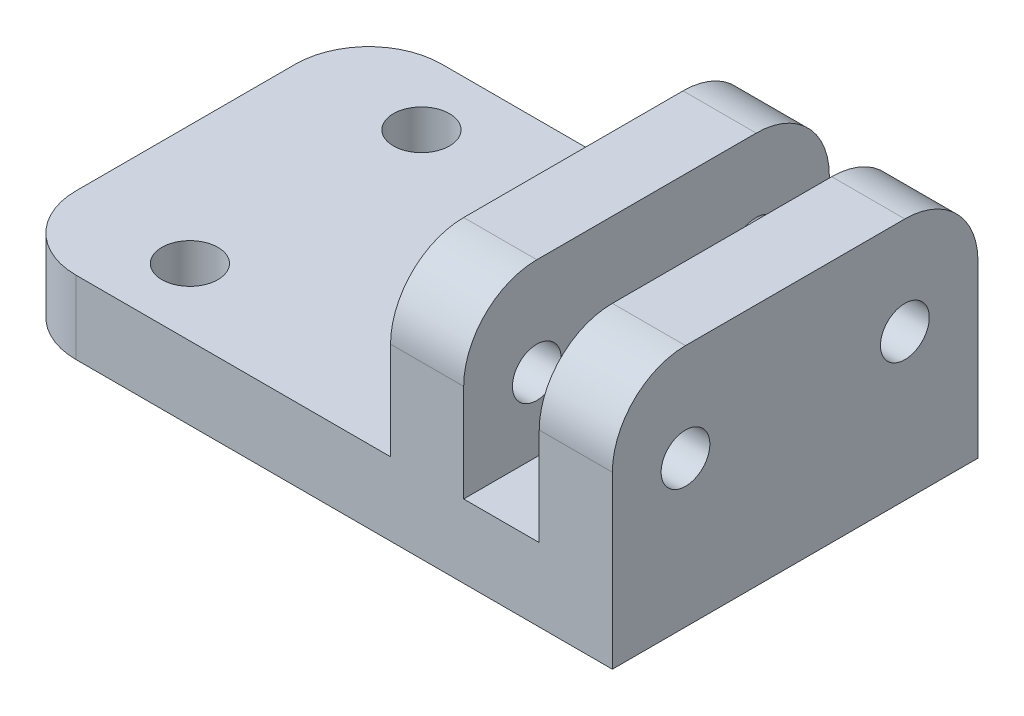
ISO-10303-21;
HEADER;
FILE_DESCRIPTION(('STEP AP214'),'2;1');
FILE_NAME('part.step','',(''),(''),'','','');
FILE_SCHEMA(('AUTOMOTIVE_DESIGN { 1 0 10303 214 1 1 1 1 }'));
ENDSEC;
DATA;
#1=APPLICATION_CONTEXT('core data for automotive mechanical design processes');
#2=APPLICATION_PROTOCOL_DEFINITION('international standard','automotive_design',2000,#1);
#3=PRODUCT_CONTEXT('',#1,'mechanical');
#4=PRODUCT('Part','Part','',(#3));
#5=PRODUCT_RELATED_PRODUCT_CATEGORY('part','',(#4));
#6=PRODUCT_DEFINITION_FORMATION('','',#4);
#7=PRODUCT_DEFINITION_CONTEXT('part definition',#1,'design');
#8=PRODUCT_DEFINITION('design','',#6,#7);
#9=PRODUCT_DEFINITION_SHAPE('','',#8);
#10=(LENGTH_UNIT() NAMED_UNIT(*) SI_UNIT(.MILLI.,.METRE.));
#11=(NAMED_UNIT(*) PLANE_ANGLE_UNIT() SI_UNIT($,.RADIAN.));
#12=(NAMED_UNIT(*) SI_UNIT($,.STERADIAN.) SOLID_ANGLE_UNIT());
#13=UNCERTAINTY_MEASURE_WITH_UNIT(LENGTH_MEASURE(1.E-05),#10,'distance_accuracy_value','');
#14=(GEOMETRIC_REPRESENTATION_CONTEXT(3) GLOBAL_UNCERTAINTY_ASSIGNED_CONTEXT((#13)) GLOBAL_UNIT_ASSIGNED_CONTEXT((#10,
#11,#12)) REPRESENTATION_CONTEXT('',''));
#15=CARTESIAN_POINT('',(0.,0.,0.));
#16=DIRECTION('',(0.,0.,1.));
#17=DIRECTION('',(1.,0.,0.));
#18=AXIS2_PLACEMENT_3D('',#15,#16,#17);
#19=CARTESIAN_POINT('',(0.,3.,0.));
#20=DIRECTION('',(0.,1.,0.));
#21=DIRECTION('',(0.,0.,1.));
#22=AXIS2_PLACEMENT_3D('',#19,#20,#21);
#23=PLANE('',#22);
#24=DIRECTION('',(1.,0.,0.));
#25=VECTOR('',#24,1.);
#26=CARTESIAN_POINT('',(0.,3.,0.));
#27=LINE('',#26,#25);
#28=CARTESIAN_POINT('',(18.9,3.,0.));
#29=VERTEX_POINT('',#28);
#30=CARTESIAN_POINT('',(22.,3.,0.));
#31=VERTEX_POINT('',#30);
#32=EDGE_CURVE('E272',#29,#31,#27,.T.);
#33=ORIENTED_EDGE('',*,*,#32,.T.);
#34=DIRECTION('',(0.,0.,-1.));
#35=VECTOR('',#34,1.);
#36=CARTESIAN_POINT('',(22.,3.,0.));
#37=LINE('',#36,#35);
#38=CARTESIAN_POINT('',(22.,3.,-15.));
#39=VERTEX_POINT('',#38);
#40=EDGE_CURVE('E485',#31,#39,#37,.T.);
#41=ORIENTED_EDGE('',*,*,#40,.T.);
#42=DIRECTION('',(1.,0.,0.));
#43=VECTOR('',#42,1.);
#44=CARTESIAN_POINT('',(0.,3.,-15.));
#45=LINE('',#44,#43);
#46=CARTESIAN_POINT('',(18.9,3.,-15.));
#47=VERTEX_POINT('',#46);
#48=EDGE_CURVE('E276',#47,#39,#45,.T.);
#49=ORIENTED_EDGE('',*,*,#48,.F.);
#50=DIRECTION('',(0.,0.,-1.));
#51=VECTOR('',#50,1.);
#52=CARTESIAN_POINT('',(18.9,3.,0.));
#53=LINE('',#52,#51);
#54=EDGE_CURVE('E257',#29,#47,#53,.T.);
#55=ORIENTED_EDGE('',*,*,#54,.F.);
#56=EDGE_LOOP('',(#33,#41,#49,#55));
#57=FACE_BOUND('',#56,.T.);
#58=ADVANCED_FACE('F35',(#57),#23,.T.);
#59=CARTESIAN_POINT('',(4.91746575843865,3.,-2.75));
#60=DIRECTION('',(0.,1.,0.));
#61=DIRECTION('',(0.,0.,1.));
#62=AXIS2_PLACEMENT_3D('',#59,#60,#61);
#63=CIRCLE('',#62,1.15);
#64=CARTESIAN_POINT('',(4.91746575843865,3.,-1.6));
#65=VERTEX_POINT('',#64);
#66=EDGE_CURVE('E188',#65,#65,#63,.T.);
#67=ORIENTED_EDGE('',*,*,#66,.F.);
#68=EDGE_LOOP('',(#67));
#69=FACE_BOUND('',#68,.T.);
#70=CARTESIAN_POINT('',(4.91746575843865,3.,-12.25));
#71=DIRECTION('',(0.,1.,0.));
#72=DIRECTION('',(0.,0.,1.));
#73=AXIS2_PLACEMENT_3D('',#70,#71,#72);
#74=CIRCLE('',#73,1.15);
#75=CARTESIAN_POINT('',(4.91746575843865,3.,-11.1));
#76=VERTEX_POINT('',#75);
#77=EDGE_CURVE('E269',#76,#76,#74,.T.);
#78=ORIENTED_EDGE('',*,*,#77,.F.);
#79=EDGE_LOOP('',(#78));
#80=FACE_BOUND('',#79,.T.);
#81=CARTESIAN_POINT('',(3.,3.,0.));
#82=VERTEX_POINT('',#81);
#83=CARTESIAN_POINT('',(15.9,3.,0.));
#84=VERTEX_POINT('',#83);
#85=EDGE_CURVE('E273',#82,#84,#27,.T.);
#86=ORIENTED_EDGE('',*,*,#85,.T.);
#87=DIRECTION('',(0.,0.,-1.));
#88=VECTOR('',#87,1.);
#89=CARTESIAN_POINT('',(15.9,3.,0.));
#90=LINE('',#89,#88);
#91=CARTESIAN_POINT('',(15.9,3.,-15.));
#92=VERTEX_POINT('',#91);
#93=EDGE_CURVE('E258',#84,#92,#90,.T.);
#94=ORIENTED_EDGE('',*,*,#93,.T.);
#95=CARTESIAN_POINT('',(3.,3.,-15.));
#96=VERTEX_POINT('',#95);
#97=EDGE_CURVE('E277',#96,#92,#45,.T.);
#98=ORIENTED_EDGE('',*,*,#97,.F.);
#99=CARTESIAN_POINT('',(3.,3.,-12.));
#100=DIRECTION('',(0.,1.,0.));
#101=DIRECTION('',(0.,0.,1.));
#102=AXIS2_PLACEMENT_3D('',#99,#100,#101);
#103=CIRCLE('',#102,3.);
#104=CARTESIAN_POINT('',(0.,3.,-12.));
#105=VERTEX_POINT('',#104);
#106=EDGE_CURVE('E203',#96,#105,#103,.T.);
#107=ORIENTED_EDGE('',*,*,#106,.T.);
#108=DIRECTION('',(0.,0.,-1.));
#109=VECTOR('',#108,1.);
#110=CARTESIAN_POINT('',(0.,3.,0.));
#111=LINE('',#110,#109);
#112=CARTESIAN_POINT('',(0.,3.,-3.));
#113=VERTEX_POINT('',#112);
#114=EDGE_CURVE('E192',#113,#105,#111,.T.);
#115=ORIENTED_EDGE('',*,*,#114,.F.);
#116=CARTESIAN_POINT('',(3.,3.,-3.));
#117=DIRECTION('',(0.,1.,0.));
#118=DIRECTION('',(0.,0.,1.));
#119=AXIS2_PLACEMENT_3D('',#116,#117,#118);
#120=CIRCLE('',#119,3.);
#121=EDGE_CURVE('E201',#113,#82,#120,.T.);
#122=ORIENTED_EDGE('',*,*,#121,.T.);
#123=EDGE_LOOP('',(#86,#94,#98,#107,#115,#122));
#124=FACE_BOUND('',#123,.T.);
#125=ADVANCED_FACE('F300',(#69,#80,#124),#23,.T.);
#126=CARTESIAN_POINT('',(0.,3.,0.));
#127=DIRECTION('',(0.,0.,-1.));
#128=DIRECTION('',(-1.,0.,0.));
#129=AXIS2_PLACEMENT_3D('',#126,#127,#128);
#130=PLANE('',#129);
#131=DIRECTION('',(0.,-1.,0.));
#132=VECTOR('',#131,1.);
#133=CARTESIAN_POINT('',(25.,10.,0.));
#134=LINE('',#133,#132);
#135=CARTESIAN_POINT('',(25.,7.,0.));
#136=VERTEX_POINT('',#135);
#137=CARTESIAN_POINT('',(25.,0.,0.));
#138=VERTEX_POINT('',#137);
#139=EDGE_CURVE('E150',#136,#138,#134,.T.);
#140=ORIENTED_EDGE('',*,*,#139,.F.);
#141=DIRECTION('',(1.,0.,0.));
#142=VECTOR('',#141,1.);
#143=CARTESIAN_POINT('',(22.,7.,0.));
#144=LINE('',#143,#142);
#145=CARTESIAN_POINT('',(22.,7.,0.));
#146=VERTEX_POINT('',#145);
#147=EDGE_CURVE('E226',#136,#146,#144,.F.);
#148=ORIENTED_EDGE('',*,*,#147,.T.);
#149=DIRECTION('',(0.,-1.,0.));
#150=VECTOR('',#149,1.);
#151=CARTESIAN_POINT('',(22.,10.,0.));
#152=LINE('',#151,#150);
#153=EDGE_CURVE('E160',#146,#31,#152,.T.);
#154=ORIENTED_EDGE('',*,*,#153,.T.);
#155=ORIENTED_EDGE('',*,*,#32,.F.);
#156=DIRECTION('',(0.,-1.,0.));
#157=VECTOR('',#156,1.);
#158=CARTESIAN_POINT('',(18.9,10.,0.));
#159=LINE('',#158,#157);
#160=CARTESIAN_POINT('',(18.9,7.,0.));
#161=VERTEX_POINT('',#160);
#162=EDGE_CURVE('E482',#161,#29,#159,.T.);
#163=ORIENTED_EDGE('',*,*,#162,.F.);
#164=DIRECTION('',(1.,0.,0.));
#165=VECTOR('',#164,1.);
#166=CARTESIAN_POINT('',(15.9,7.,0.));
#167=LINE('',#166,#165);
#168=CARTESIAN_POINT('',(15.9,7.,0.));
#169=VERTEX_POINT('',#168);
#170=EDGE_CURVE('E224',#161,#169,#167,.F.);
#171=ORIENTED_EDGE('',*,*,#170,.T.);
#172=DIRECTION('',(0.,-1.,0.));
#173=VECTOR('',#172,1.);
#174=CARTESIAN_POINT('',(15.9,10.,0.));
#175=LINE('',#174,#173);
#176=EDGE_CURVE('E262',#169,#84,#175,.T.);
#177=ORIENTED_EDGE('',*,*,#176,.T.);
#178=ORIENTED_EDGE('',*,*,#85,.F.);
#179=DIRECTION('',(0.,-1.,0.));
#180=VECTOR('',#179,1.);
#181=CARTESIAN_POINT('',(3.,0.,0.));
#182=LINE('',#181,#180);
#183=CARTESIAN_POINT('',(3.,0.,0.));
#184=VERTEX_POINT('',#183);
#185=EDGE_CURVE('E176',#82,#184,#182,.T.);
#186=ORIENTED_EDGE('',*,*,#185,.T.);
#187=DIRECTION('',(1.,0.,0.));
#188=VECTOR('',#187,1.);
#189=CARTESIAN_POINT('',(0.,0.,0.));
#190=LINE('',#189,#188);
#191=EDGE_CURVE('E168',#184,#138,#190,.T.);
#192=ORIENTED_EDGE('',*,*,#191,.T.);
#193=EDGE_LOOP('',(#140,#148,#154,#155,#163,#171,#177,#178,#186,#192));
#194=FACE_BOUND('',#193,.T.);
#195=ADVANCED_FACE('F173',(#194),#130,.F.);
#196=CARTESIAN_POINT('',(25.,3.,0.));
#197=DIRECTION('',(-1.,0.,0.));
#198=DIRECTION('',(0.,0.,1.));
#199=AXIS2_PLACEMENT_3D('',#196,#197,#198);
#200=PLANE('',#199);
#201=CARTESIAN_POINT('',(25.,6.,-12.));
#202=DIRECTION('',(-1.,0.,0.));
#203=DIRECTION('',(0.,0.,1.));
#204=AXIS2_PLACEMENT_3D('',#201,#202,#203);
#205=CIRCLE('',#204,1.);
#206=CARTESIAN_POINT('',(25.,6.,-11.));
#207=VERTEX_POINT('',#206);
#208=EDGE_CURVE('E211',#207,#207,#205,.T.);
#209=ORIENTED_EDGE('',*,*,#208,.T.);
#210=EDGE_LOOP('',(#209));
#211=FACE_BOUND('',#210,.T.);
#212=CARTESIAN_POINT('',(25.,6.,-3.));
#213=DIRECTION('',(-1.,0.,0.));
#214=DIRECTION('',(0.,0.,1.));
#215=AXIS2_PLACEMENT_3D('',#212,#213,#214);
#216=CIRCLE('',#215,1.);
#217=CARTESIAN_POINT('',(25.,6.,-2.));
#218=VERTEX_POINT('',#217);
#219=EDGE_CURVE('E533',#218,#218,#216,.T.);
#220=ORIENTED_EDGE('',*,*,#219,.T.);
#221=EDGE_LOOP('',(#220));
#222=FACE_BOUND('',#221,.T.);
#223=DIRECTION('',(0.,0.,-1.));
#224=VECTOR('',#223,1.);
#225=CARTESIAN_POINT('',(25.,10.,0.));
#226=LINE('',#225,#224);
#227=CARTESIAN_POINT('',(25.,10.,-3.));
#228=VERTEX_POINT('',#227);
#229=CARTESIAN_POINT('',(25.,10.,-12.));
#230=VERTEX_POINT('',#229);
#231=EDGE_CURVE('E501',#228,#230,#226,.T.);
#232=ORIENTED_EDGE('',*,*,#231,.F.);
#233=CARTESIAN_POINT('',(25.,7.,-3.));
#234=DIRECTION('',(-1.,0.,0.));
#235=DIRECTION('',(0.,0.,1.));
#236=AXIS2_PLACEMENT_3D('',#233,#234,#235);
#237=CIRCLE('',#236,3.);
#238=EDGE_CURVE('E156',#228,#136,#237,.F.);
#239=ORIENTED_EDGE('',*,*,#238,.T.);
#240=ORIENTED_EDGE('',*,*,#139,.T.);
#241=DIRECTION('',(0.,0.,-1.));
#242=VECTOR('',#241,1.);
#243=CARTESIAN_POINT('',(25.,0.,0.));
#244=LINE('',#243,#242);
#245=CARTESIAN_POINT('',(25.,0.,-15.));
#246=VERTEX_POINT('',#245);
#247=EDGE_CURVE('E155',#138,#246,#244,.T.);
#248=ORIENTED_EDGE('',*,*,#247,.T.);
#249=DIRECTION('',(0.,-1.,0.));
#250=VECTOR('',#249,1.);
#251=CARTESIAN_POINT('',(25.,10.,-15.));
#252=LINE('',#251,#250);
#253=CARTESIAN_POINT('',(25.,7.,-15.));
#254=VERTEX_POINT('',#253);
#255=EDGE_CURVE('E161',#254,#246,#252,.T.);
#256=ORIENTED_EDGE('',*,*,#255,.F.);
#257=CARTESIAN_POINT('',(25.,7.,-12.));
#258=DIRECTION('',(-1.,0.,0.));
#259=DIRECTION('',(0.,0.,1.));
#260=AXIS2_PLACEMENT_3D('',#257,#258,#259);
#261=CIRCLE('',#260,3.);
#262=EDGE_CURVE('E221',#254,#230,#261,.F.);
#263=ORIENTED_EDGE('',*,*,#262,.T.);
#264=EDGE_LOOP('',(#232,#239,#240,#248,#256,#263));
#265=FACE_BOUND('',#264,.T.);
#266=ADVANCED_FACE('F153',(#211,#222,#265),#200,.F.);
#267=CARTESIAN_POINT('',(0.,3.,-15.));
#268=DIRECTION('',(0.,0.,-1.));
#269=DIRECTION('',(-1.,0.,0.));
#270=AXIS2_PLACEMENT_3D('',#267,#268,#269);
#271=PLANE('',#270);
#272=DIRECTION('',(0.,-1.,0.));
#273=VECTOR('',#272,1.);
#274=CARTESIAN_POINT('',(22.,10.,-15.));
#275=LINE('',#274,#273);
#276=CARTESIAN_POINT('',(22.,7.,-15.));
#277=VERTEX_POINT('',#276);
#278=EDGE_CURVE('E509',#277,#39,#275,.T.);
#279=ORIENTED_EDGE('',*,*,#278,.F.);
#280=DIRECTION('',(1.,0.,0.));
#281=VECTOR('',#280,1.);
#282=CARTESIAN_POINT('',(0.,7.,-15.));
#283=LINE('',#282,#281);
#284=EDGE_CURVE('E11',#277,#254,#283,.T.);
#285=ORIENTED_EDGE('',*,*,#284,.T.);
#286=ORIENTED_EDGE('',*,*,#255,.T.);
#287=DIRECTION('',(1.,0.,0.));
#288=VECTOR('',#287,1.);
#289=CARTESIAN_POINT('',(0.,0.,-15.));
#290=LINE('',#289,#288);
#291=CARTESIAN_POINT('',(3.,0.,-15.));
#292=VERTEX_POINT('',#291);
#293=EDGE_CURVE('E170',#292,#246,#290,.T.);
#294=ORIENTED_EDGE('',*,*,#293,.F.);
#295=DIRECTION('',(0.,-1.,0.));
#296=VECTOR('',#295,1.);
#297=CARTESIAN_POINT('',(3.,3.,-15.));
#298=LINE('',#297,#296);
#299=EDGE_CURVE('E199',#292,#96,#298,.F.);
#300=ORIENTED_EDGE('',*,*,#299,.T.);
#301=ORIENTED_EDGE('',*,*,#97,.T.);
#302=DIRECTION('',(0.,-1.,0.));
#303=VECTOR('',#302,1.);
#304=CARTESIAN_POINT('',(15.9,10.,-15.));
#305=LINE('',#304,#303);
#306=CARTESIAN_POINT('',(15.9,7.,-15.));
#307=VERTEX_POINT('',#306);
#308=EDGE_CURVE('E250',#307,#92,#305,.T.);
#309=ORIENTED_EDGE('',*,*,#308,.F.);
#310=DIRECTION('',(1.,0.,0.));
#311=VECTOR('',#310,1.);
#312=CARTESIAN_POINT('',(0.,7.,-15.));
#313=LINE('',#312,#311);
#314=CARTESIAN_POINT('',(18.9,7.,-15.));
#315=VERTEX_POINT('',#314);
#316=EDGE_CURVE('E43',#307,#315,#313,.T.);
#317=ORIENTED_EDGE('',*,*,#316,.T.);
#318=DIRECTION('',(0.,-1.,0.));
#319=VECTOR('',#318,1.);
#320=CARTESIAN_POINT('',(18.9,10.,-15.));
#321=LINE('',#320,#319);
#322=EDGE_CURVE('E247',#315,#47,#321,.T.);
#323=ORIENTED_EDGE('',*,*,#322,.T.);
#324=ORIENTED_EDGE('',*,*,#48,.T.);
#325=EDGE_LOOP('',(#279,#285,#286,#294,#300,#301,#309,#317,#323,#324));
#326=FACE_BOUND('',#325,.T.);
#327=ADVANCED_FACE('F245',(#326),#271,.T.);
#328=CARTESIAN_POINT('',(4.91746575843865,3.,-12.25));
#329=DIRECTION('',(0.,-1.,0.));
#330=DIRECTION('',(0.,0.,-1.));
#331=AXIS2_PLACEMENT_3D('',#328,#329,#330);
#332=CYLINDRICAL_SURFACE('',#331,1.15);
#333=ORIENTED_EDGE('',*,*,#77,.T.);
#334=EDGE_LOOP('',(#333));
#335=FACE_BOUND('',#334,.T.);
#336=CARTESIAN_POINT('',(4.91746575843865,0.,-12.25));
#337=DIRECTION('',(0.,1.,0.));
#338=DIRECTION('',(0.,0.,1.));
#339=AXIS2_PLACEMENT_3D('',#336,#337,#338);
#340=CIRCLE('',#339,1.15);
#341=CARTESIAN_POINT('',(4.91746575843865,0.,-11.1));
#342=VERTEX_POINT('',#341);
#343=EDGE_CURVE('E177',#342,#342,#340,.T.);
#344=ORIENTED_EDGE('',*,*,#343,.F.);
#345=EDGE_LOOP('',(#344));
#346=FACE_BOUND('',#345,.T.);
#347=ADVANCED_FACE('F287',(#335,#346),#332,.F.);
#348=CARTESIAN_POINT('',(4.91746575843865,3.,-2.75));
#349=DIRECTION('',(0.,-1.,0.));
#350=DIRECTION('',(0.,0.,-1.));
#351=AXIS2_PLACEMENT_3D('',#348,#349,#350);
#352=CYLINDRICAL_SURFACE('',#351,1.15);
#353=ORIENTED_EDGE('',*,*,#66,.T.);
#354=EDGE_LOOP('',(#353));
#355=FACE_BOUND('',#354,.T.);
#356=CARTESIAN_POINT('',(4.91746575843865,0.,-2.75));
#357=DIRECTION('',(0.,1.,0.));
#358=DIRECTION('',(0.,0.,1.));
#359=AXIS2_PLACEMENT_3D('',#356,#357,#358);
#360=CIRCLE('',#359,1.15);
#361=CARTESIAN_POINT('',(4.91746575843865,0.,-1.6));
#362=VERTEX_POINT('',#361);
#363=EDGE_CURVE('E180',#362,#362,#360,.T.);
#364=ORIENTED_EDGE('',*,*,#363,.F.);
#365=EDGE_LOOP('',(#364));
#366=FACE_BOUND('',#365,.T.);
#367=ADVANCED_FACE('F284',(#355,#366),#352,.F.);
#368=CARTESIAN_POINT('',(0.,3.,0.));
#369=DIRECTION('',(-1.,0.,0.));
#370=DIRECTION('',(0.,0.,1.));
#371=AXIS2_PLACEMENT_3D('',#368,#369,#370);
#372=PLANE('',#371);
#373=ORIENTED_EDGE('',*,*,#114,.T.);
#374=DIRECTION('',(0.,-1.,0.));
#375=VECTOR('',#374,1.);
#376=CARTESIAN_POINT('',(0.,3.,-12.));
#377=LINE('',#376,#375);
#378=CARTESIAN_POINT('',(0.,0.,-12.));
#379=VERTEX_POINT('',#378);
#380=EDGE_CURVE('E191',#105,#379,#377,.T.);
#381=ORIENTED_EDGE('',*,*,#380,.T.);
#382=DIRECTION('',(0.,0.,-1.));
#383=VECTOR('',#382,1.);
#384=CARTESIAN_POINT('',(0.,0.,0.));
#385=LINE('',#384,#383);
#386=CARTESIAN_POINT('',(0.,0.,-3.));
#387=VERTEX_POINT('',#386);
#388=EDGE_CURVE('E185',#387,#379,#385,.T.);
#389=ORIENTED_EDGE('',*,*,#388,.F.);
#390=DIRECTION('',(0.,-1.,0.));
#391=VECTOR('',#390,1.);
#392=CARTESIAN_POINT('',(0.,3.,-3.));
#393=LINE('',#392,#391);
#394=EDGE_CURVE('E189',#387,#113,#393,.F.);
#395=ORIENTED_EDGE('',*,*,#394,.T.);
#396=EDGE_LOOP('',(#373,#381,#389,#395));
#397=FACE_BOUND('',#396,.T.);
#398=ADVANCED_FACE('F286',(#397),#372,.T.);
#399=CARTESIAN_POINT('',(0.,0.,0.));
#400=DIRECTION('',(0.,1.,0.));
#401=DIRECTION('',(0.,0.,1.));
#402=AXIS2_PLACEMENT_3D('',#399,#400,#401);
#403=PLANE('',#402);
#404=ORIENTED_EDGE('',*,*,#247,.F.);
#405=ORIENTED_EDGE('',*,*,#191,.F.);
#406=CARTESIAN_POINT('',(3.,0.,-3.));
#407=DIRECTION('',(0.,1.,0.));
#408=DIRECTION('',(0.,0.,1.));
#409=AXIS2_PLACEMENT_3D('',#406,#407,#408);
#410=CIRCLE('',#409,3.);
#411=EDGE_CURVE('E195',#184,#387,#410,.F.);
#412=ORIENTED_EDGE('',*,*,#411,.T.);
#413=ORIENTED_EDGE('',*,*,#388,.T.);
#414=CARTESIAN_POINT('',(3.,0.,-12.));
#415=DIRECTION('',(0.,1.,0.));
#416=DIRECTION('',(0.,0.,1.));
#417=AXIS2_PLACEMENT_3D('',#414,#415,#416);
#418=CIRCLE('',#417,3.);
#419=EDGE_CURVE('E197',#379,#292,#418,.F.);
#420=ORIENTED_EDGE('',*,*,#419,.T.);
#421=ORIENTED_EDGE('',*,*,#293,.T.);
#422=EDGE_LOOP('',(#404,#405,#412,#413,#420,#421));
#423=FACE_BOUND('',#422,.T.);
#424=ORIENTED_EDGE('',*,*,#363,.T.);
#425=EDGE_LOOP('',(#424));
#426=FACE_BOUND('',#425,.T.);
#427=ORIENTED_EDGE('',*,*,#343,.T.);
#428=EDGE_LOOP('',(#427));
#429=FACE_BOUND('',#428,.T.);
#430=ADVANCED_FACE('F166',(#423,#426,#429),#403,.F.);
#431=CARTESIAN_POINT('',(3.,3.,-12.));
#432=DIRECTION('',(0.,-1.,0.));
#433=DIRECTION('',(0.,0.,-1.));
#434=AXIS2_PLACEMENT_3D('',#431,#432,#433);
#435=CYLINDRICAL_SURFACE('',#434,3.);
#436=ORIENTED_EDGE('',*,*,#106,.F.);
#437=ORIENTED_EDGE('',*,*,#299,.F.);
#438=ORIENTED_EDGE('',*,*,#419,.F.);
#439=ORIENTED_EDGE('',*,*,#380,.F.);
#440=EDGE_LOOP('',(#436,#437,#438,#439));
#441=FACE_BOUND('',#440,.T.);
#442=ADVANCED_FACE('F312',(#441),#435,.T.);
#443=CARTESIAN_POINT('',(3.,3.,-3.));
#444=DIRECTION('',(0.,1.,0.));
#445=DIRECTION('',(0.,0.,1.));
#446=AXIS2_PLACEMENT_3D('',#443,#444,#445);
#447=CYLINDRICAL_SURFACE('',#446,3.);
#448=ORIENTED_EDGE('',*,*,#121,.F.);
#449=ORIENTED_EDGE('',*,*,#394,.F.);
#450=ORIENTED_EDGE('',*,*,#411,.F.);
#451=ORIENTED_EDGE('',*,*,#185,.F.);
#452=EDGE_LOOP('',(#448,#449,#450,#451));
#453=FACE_BOUND('',#452,.T.);
#454=ADVANCED_FACE('F359',(#453),#447,.T.);
#455=CARTESIAN_POINT('',(18.9,10.,0.));
#456=DIRECTION('',(1.,0.,0.));
#457=DIRECTION('',(0.,0.,-1.));
#458=AXIS2_PLACEMENT_3D('',#455,#456,#457);
#459=PLANE('',#458);
#460=CARTESIAN_POINT('',(18.9,6.,-12.));
#461=DIRECTION('',(1.,0.,0.));
#462=DIRECTION('',(0.,0.,-1.));
#463=AXIS2_PLACEMENT_3D('',#460,#461,#462);
#464=CIRCLE('',#463,1.);
#465=CARTESIAN_POINT('',(18.9,6.,-13.));
#466=VERTEX_POINT('',#465);
#467=EDGE_CURVE('E523',#466,#466,#464,.T.);
#468=ORIENTED_EDGE('',*,*,#467,.F.);
#469=EDGE_LOOP('',(#468));
#470=FACE_BOUND('',#469,.T.);
#471=CARTESIAN_POINT('',(18.9,6.,-3.));
#472=DIRECTION('',(1.,0.,0.));
#473=DIRECTION('',(0.,0.,-1.));
#474=AXIS2_PLACEMENT_3D('',#471,#472,#473);
#475=CIRCLE('',#474,1.);
#476=CARTESIAN_POINT('',(18.9,6.,-4.));
#477=VERTEX_POINT('',#476);
#478=EDGE_CURVE('E216',#477,#477,#475,.T.);
#479=ORIENTED_EDGE('',*,*,#478,.F.);
#480=EDGE_LOOP('',(#479));
#481=FACE_BOUND('',#480,.T.);
#482=DIRECTION('',(0.,0.,1.));
#483=VECTOR('',#482,1.);
#484=CARTESIAN_POINT('',(18.9,10.,0.));
#485=LINE('',#484,#483);
#486=CARTESIAN_POINT('',(18.9,10.,-12.));
#487=VERTEX_POINT('',#486);
#488=CARTESIAN_POINT('',(18.9,10.,-3.));
#489=VERTEX_POINT('',#488);
#490=EDGE_CURVE('E478',#487,#489,#485,.T.);
#491=ORIENTED_EDGE('',*,*,#490,.T.);
#492=CARTESIAN_POINT('',(18.9,7.,-3.));
#493=DIRECTION('',(1.,0.,0.));
#494=DIRECTION('',(0.,0.,-1.));
#495=AXIS2_PLACEMENT_3D('',#492,#493,#494);
#496=CIRCLE('',#495,3.);
#497=EDGE_CURVE('E238',#489,#161,#496,.T.);
#498=ORIENTED_EDGE('',*,*,#497,.T.);
#499=ORIENTED_EDGE('',*,*,#162,.T.);
#500=ORIENTED_EDGE('',*,*,#54,.T.);
#501=ORIENTED_EDGE('',*,*,#322,.F.);
#502=CARTESIAN_POINT('',(18.9,7.,-12.));
#503=DIRECTION('',(1.,0.,0.));
#504=DIRECTION('',(0.,0.,-1.));
#505=AXIS2_PLACEMENT_3D('',#502,#503,#504);
#506=CIRCLE('',#505,3.);
#507=EDGE_CURVE('E58',#315,#487,#506,.T.);
#508=ORIENTED_EDGE('',*,*,#507,.T.);
#509=EDGE_LOOP('',(#491,#498,#499,#500,#501,#508));
#510=FACE_BOUND('',#509,.T.);
#511=ADVANCED_FACE('F254',(#470,#481,#510),#459,.T.);
#512=CARTESIAN_POINT('',(15.9,10.,0.));
#513=DIRECTION('',(1.,0.,0.));
#514=DIRECTION('',(0.,0.,-1.));
#515=AXIS2_PLACEMENT_3D('',#512,#513,#514);
#516=PLANE('',#515);
#517=CARTESIAN_POINT('',(15.9,6.,-12.));
#518=DIRECTION('',(1.,0.,0.));
#519=DIRECTION('',(0.,0.,-1.));
#520=AXIS2_PLACEMENT_3D('',#517,#518,#519);
#521=CIRCLE('',#520,1.);
#522=CARTESIAN_POINT('',(15.9,6.,-13.));
#523=VERTEX_POINT('',#522);
#524=EDGE_CURVE('E215',#523,#523,#521,.T.);
#525=ORIENTED_EDGE('',*,*,#524,.T.);
#526=EDGE_LOOP('',(#525));
#527=FACE_BOUND('',#526,.T.);
#528=CARTESIAN_POINT('',(15.9,6.,-3.));
#529=DIRECTION('',(1.,0.,0.));
#530=DIRECTION('',(0.,0.,-1.));
#531=AXIS2_PLACEMENT_3D('',#528,#529,#530);
#532=CIRCLE('',#531,1.);
#533=CARTESIAN_POINT('',(15.9,6.,-4.));
#534=VERTEX_POINT('',#533);
#535=EDGE_CURVE('E210',#534,#534,#532,.T.);
#536=ORIENTED_EDGE('',*,*,#535,.T.);
#537=EDGE_LOOP('',(#536));
#538=FACE_BOUND('',#537,.T.);
#539=ORIENTED_EDGE('',*,*,#176,.F.);
#540=CARTESIAN_POINT('',(15.9,7.,-3.));
#541=DIRECTION('',(1.,0.,0.));
#542=DIRECTION('',(0.,0.,-1.));
#543=AXIS2_PLACEMENT_3D('',#540,#541,#542);
#544=CIRCLE('',#543,3.);
#545=CARTESIAN_POINT('',(15.9,10.,-3.));
#546=VERTEX_POINT('',#545);
#547=EDGE_CURVE('E241',#169,#546,#544,.F.);
#548=ORIENTED_EDGE('',*,*,#547,.T.);
#549=DIRECTION('',(0.,0.,1.));
#550=VECTOR('',#549,1.);
#551=CARTESIAN_POINT('',(15.9,10.,0.));
#552=LINE('',#551,#550);
#553=CARTESIAN_POINT('',(15.9,10.,-12.));
#554=VERTEX_POINT('',#553);
#555=EDGE_CURVE('E476',#554,#546,#552,.T.);
#556=ORIENTED_EDGE('',*,*,#555,.F.);
#557=CARTESIAN_POINT('',(15.9,7.,-12.));
#558=DIRECTION('',(1.,0.,0.));
#559=DIRECTION('',(0.,0.,-1.));
#560=AXIS2_PLACEMENT_3D('',#557,#558,#559);
#561=CIRCLE('',#560,3.);
#562=EDGE_CURVE('E50',#554,#307,#561,.F.);
#563=ORIENTED_EDGE('',*,*,#562,.T.);
#564=ORIENTED_EDGE('',*,*,#308,.T.);
#565=ORIENTED_EDGE('',*,*,#93,.F.);
#566=EDGE_LOOP('',(#539,#548,#556,#563,#564,#565));
#567=FACE_BOUND('',#566,.T.);
#568=ADVANCED_FACE('F480',(#527,#538,#567),#516,.F.);
#569=CARTESIAN_POINT('',(0.,10.,0.));
#570=DIRECTION('',(0.,1.,0.));
#571=DIRECTION('',(0.,0.,1.));
#572=AXIS2_PLACEMENT_3D('',#569,#570,#571);
#573=PLANE('',#572);
#574=ORIENTED_EDGE('',*,*,#555,.T.);
#575=DIRECTION('',(1.,0.,0.));
#576=VECTOR('',#575,1.);
#577=CARTESIAN_POINT('',(18.9,10.,-3.));
#578=LINE('',#577,#576);
#579=EDGE_CURVE('E234',#546,#489,#578,.T.);
#580=ORIENTED_EDGE('',*,*,#579,.T.);
#581=ORIENTED_EDGE('',*,*,#490,.F.);
#582=DIRECTION('',(1.,0.,0.));
#583=VECTOR('',#582,1.);
#584=CARTESIAN_POINT('',(0.,10.,-12.));
#585=LINE('',#584,#583);
#586=EDGE_CURVE('E232',#487,#554,#585,.F.);
#587=ORIENTED_EDGE('',*,*,#586,.T.);
#588=EDGE_LOOP('',(#574,#580,#581,#587));
#589=FACE_BOUND('',#588,.T.);
#590=ADVANCED_FACE('F475',(#589),#573,.T.);
#591=CARTESIAN_POINT('',(22.,10.,0.));
#592=DIRECTION('',(1.,0.,0.));
#593=DIRECTION('',(0.,0.,-1.));
#594=AXIS2_PLACEMENT_3D('',#591,#592,#593);
#595=PLANE('',#594);
#596=CARTESIAN_POINT('',(22.,6.,-12.));
#597=DIRECTION('',(1.,0.,0.));
#598=DIRECTION('',(0.,0.,-1.));
#599=AXIS2_PLACEMENT_3D('',#596,#597,#598);
#600=CIRCLE('',#599,1.);
#601=CARTESIAN_POINT('',(22.,6.,-13.));
#602=VERTEX_POINT('',#601);
#603=EDGE_CURVE('E212',#602,#602,#600,.T.);
#604=ORIENTED_EDGE('',*,*,#603,.T.);
#605=EDGE_LOOP('',(#604));
#606=FACE_BOUND('',#605,.T.);
#607=CARTESIAN_POINT('',(22.,6.,-3.));
#608=DIRECTION('',(1.,0.,0.));
#609=DIRECTION('',(0.,0.,-1.));
#610=AXIS2_PLACEMENT_3D('',#607,#608,#609);
#611=CIRCLE('',#610,1.);
#612=CARTESIAN_POINT('',(22.,6.,-4.));
#613=VERTEX_POINT('',#612);
#614=EDGE_CURVE('E207',#613,#613,#611,.T.);
#615=ORIENTED_EDGE('',*,*,#614,.T.);
#616=EDGE_LOOP('',(#615));
#617=FACE_BOUND('',#616,.T.);
#618=ORIENTED_EDGE('',*,*,#153,.F.);
#619=CARTESIAN_POINT('',(22.,7.,-3.));
#620=DIRECTION('',(1.,0.,0.));
#621=DIRECTION('',(0.,0.,-1.));
#622=AXIS2_PLACEMENT_3D('',#619,#620,#621);
#623=CIRCLE('',#622,3.);
#624=CARTESIAN_POINT('',(22.,10.,-3.));
#625=VERTEX_POINT('',#624);
#626=EDGE_CURVE('E230',#146,#625,#623,.F.);
#627=ORIENTED_EDGE('',*,*,#626,.T.);
#628=DIRECTION('',(0.,0.,1.));
#629=VECTOR('',#628,1.);
#630=CARTESIAN_POINT('',(22.,10.,0.));
#631=LINE('',#630,#629);
#632=CARTESIAN_POINT('',(22.,10.,-12.));
#633=VERTEX_POINT('',#632);
#634=EDGE_CURVE('E504',#633,#625,#631,.T.);
#635=ORIENTED_EDGE('',*,*,#634,.F.);
#636=CARTESIAN_POINT('',(22.,7.,-12.));
#637=DIRECTION('',(1.,0.,0.));
#638=DIRECTION('',(0.,0.,-1.));
#639=AXIS2_PLACEMENT_3D('',#636,#637,#638);
#640=CIRCLE('',#639,3.);
#641=EDGE_CURVE('E228',#633,#277,#640,.F.);
#642=ORIENTED_EDGE('',*,*,#641,.T.);
#643=ORIENTED_EDGE('',*,*,#278,.T.);
#644=ORIENTED_EDGE('',*,*,#40,.F.);
#645=EDGE_LOOP('',(#618,#627,#635,#642,#643,#644));
#646=FACE_BOUND('',#645,.T.);
#647=ADVANCED_FACE('F522',(#606,#617,#646),#595,.F.);
#648=CARTESIAN_POINT('',(0.,10.,0.));
#649=DIRECTION('',(0.,1.,0.));
#650=DIRECTION('',(0.,0.,1.));
#651=AXIS2_PLACEMENT_3D('',#648,#649,#650);
#652=PLANE('',#651);
#653=ORIENTED_EDGE('',*,*,#634,.T.);
#654=DIRECTION('',(1.,0.,0.));
#655=VECTOR('',#654,1.);
#656=CARTESIAN_POINT('',(25.,10.,-3.));
#657=LINE('',#656,#655);
#658=EDGE_CURVE('E218',#625,#228,#657,.T.);
#659=ORIENTED_EDGE('',*,*,#658,.T.);
#660=ORIENTED_EDGE('',*,*,#231,.T.);
#661=DIRECTION('',(1.,0.,0.));
#662=VECTOR('',#661,1.);
#663=CARTESIAN_POINT('',(0.,10.,-12.));
#664=LINE('',#663,#662);
#665=EDGE_CURVE('E206',#230,#633,#664,.F.);
#666=ORIENTED_EDGE('',*,*,#665,.T.);
#667=EDGE_LOOP('',(#653,#659,#660,#666));
#668=FACE_BOUND('',#667,.T.);
#669=ADVANCED_FACE('F403',(#668),#652,.T.);
#670=CARTESIAN_POINT('',(25.,6.,-3.));
#671=DIRECTION('',(-1.,0.,0.));
#672=DIRECTION('',(0.,0.,1.));
#673=AXIS2_PLACEMENT_3D('',#670,#671,#672);
#674=CYLINDRICAL_SURFACE('',#673,1.);
#675=ORIENTED_EDGE('',*,*,#219,.F.);
#676=EDGE_LOOP('',(#675));
#677=FACE_BOUND('',#676,.T.);
#678=ORIENTED_EDGE('',*,*,#614,.F.);
#679=EDGE_LOOP('',(#678));
#680=FACE_BOUND('',#679,.T.);
#681=ADVANCED_FACE('F397',(#677,#680),#674,.F.);
#682=CARTESIAN_POINT('',(25.,6.,-12.));
#683=DIRECTION('',(-1.,0.,0.));
#684=DIRECTION('',(0.,0.,1.));
#685=AXIS2_PLACEMENT_3D('',#682,#683,#684);
#686=CYLINDRICAL_SURFACE('',#685,1.);
#687=ORIENTED_EDGE('',*,*,#208,.F.);
#688=EDGE_LOOP('',(#687));
#689=FACE_BOUND('',#688,.T.);
#690=ORIENTED_EDGE('',*,*,#603,.F.);
#691=EDGE_LOOP('',(#690));
#692=FACE_BOUND('',#691,.T.);
#693=ADVANCED_FACE('F402',(#689,#692),#686,.F.);
#694=ORIENTED_EDGE('',*,*,#478,.T.);
#695=EDGE_LOOP('',(#694));
#696=FACE_BOUND('',#695,.T.);
#697=ORIENTED_EDGE('',*,*,#535,.F.);
#698=EDGE_LOOP('',(#697));
#699=FACE_BOUND('',#698,.T.);
#700=ADVANCED_FACE('F406',(#696,#699),#674,.F.);
#701=ORIENTED_EDGE('',*,*,#467,.T.);
#702=EDGE_LOOP('',(#701));
#703=FACE_BOUND('',#702,.T.);
#704=ORIENTED_EDGE('',*,*,#524,.F.);
#705=EDGE_LOOP('',(#704));
#706=FACE_BOUND('',#705,.T.);
#707=ADVANCED_FACE('F418',(#703,#706),#686,.F.);
#708=CARTESIAN_POINT('',(0.,7.,-3.));
#709=DIRECTION('',(-1.,0.,0.));
#710=DIRECTION('',(0.,0.,1.));
#711=AXIS2_PLACEMENT_3D('',#708,#709,#710);
#712=CYLINDRICAL_SURFACE('',#711,3.);
#713=ORIENTED_EDGE('',*,*,#626,.F.);
#714=ORIENTED_EDGE('',*,*,#147,.F.);
#715=ORIENTED_EDGE('',*,*,#238,.F.);
#716=ORIENTED_EDGE('',*,*,#658,.F.);
#717=EDGE_LOOP('',(#713,#714,#715,#716));
#718=FACE_BOUND('',#717,.T.);
#719=ADVANCED_FACE('F432',(#718),#712,.T.);
#720=CARTESIAN_POINT('',(0.,7.,-3.));
#721=DIRECTION('',(-1.,0.,0.));
#722=DIRECTION('',(0.,0.,1.));
#723=AXIS2_PLACEMENT_3D('',#720,#721,#722);
#724=CYLINDRICAL_SURFACE('',#723,3.);
#725=ORIENTED_EDGE('',*,*,#547,.F.);
#726=ORIENTED_EDGE('',*,*,#170,.F.);
#727=ORIENTED_EDGE('',*,*,#497,.F.);
#728=ORIENTED_EDGE('',*,*,#579,.F.);
#729=EDGE_LOOP('',(#725,#726,#727,#728));
#730=FACE_BOUND('',#729,.T.);
#731=ADVANCED_FACE('F442',(#730),#724,.T.);
#732=CARTESIAN_POINT('',(0.,7.,-12.));
#733=DIRECTION('',(1.,0.,0.));
#734=DIRECTION('',(0.,0.,-1.));
#735=AXIS2_PLACEMENT_3D('',#732,#733,#734);
#736=CYLINDRICAL_SURFACE('',#735,3.);
#737=ORIENTED_EDGE('',*,*,#641,.F.);
#738=ORIENTED_EDGE('',*,*,#665,.F.);
#739=ORIENTED_EDGE('',*,*,#262,.F.);
#740=ORIENTED_EDGE('',*,*,#284,.F.);
#741=EDGE_LOOP('',(#737,#738,#739,#740));
#742=FACE_BOUND('',#741,.T.);
#743=ADVANCED_FACE('F450',(#742),#736,.T.);
#744=CARTESIAN_POINT('',(0.,7.,-12.));
#745=DIRECTION('',(1.,0.,0.));
#746=DIRECTION('',(0.,0.,-1.));
#747=AXIS2_PLACEMENT_3D('',#744,#745,#746);
#748=CYLINDRICAL_SURFACE('',#747,3.);
#749=ORIENTED_EDGE('',*,*,#562,.F.);
#750=ORIENTED_EDGE('',*,*,#586,.F.);
#751=ORIENTED_EDGE('',*,*,#507,.F.);
#752=ORIENTED_EDGE('',*,*,#316,.F.);
#753=EDGE_LOOP('',(#749,#750,#751,#752));
#754=FACE_BOUND('',#753,.T.);
#755=ADVANCED_FACE('F37',(#754),#748,.T.);
#756=CLOSED_SHELL('',(#58,#125,#195,#266,#327,#347,#367,#398,#430,#442,#454,#511,#568,#590,#647,
#669,#681,#693,#700,#707,#719,#731,#743,#755));
#757=MANIFOLD_SOLID_BREP('B2',#756);
#758=ADVANCED_BREP_SHAPE_REPRESENTATION('',(#18,#757),#14);
#759=SHAPE_DEFINITION_REPRESENTATION(#9,#758);
ENDSEC;
END-ISO-10303-21;
